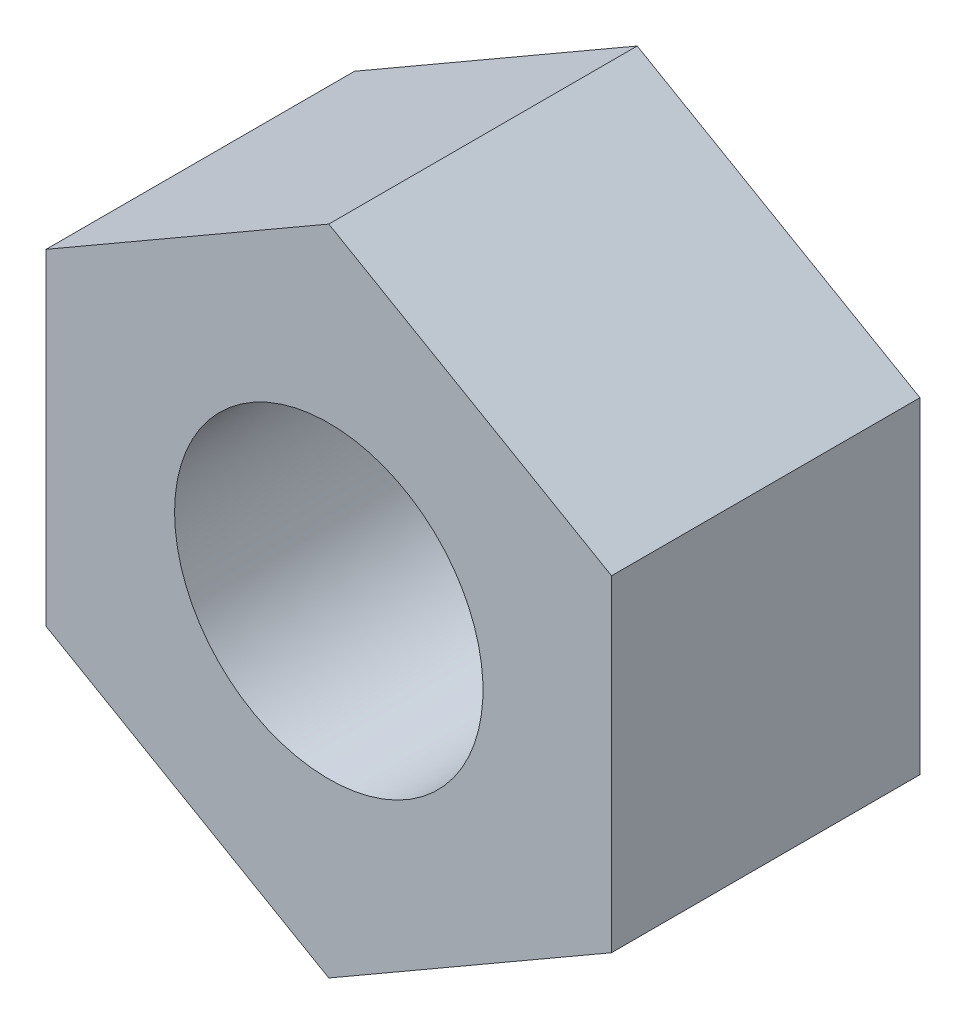
ISO-10303-21;
HEADER;
FILE_DESCRIPTION(('STEP AP214'),'2;1');
FILE_NAME('part.step','',(''),(''),'','','');
FILE_SCHEMA(('AUTOMOTIVE_DESIGN { 1 0 10303 214 1 1 1 1 }'));
ENDSEC;
DATA;
#1=APPLICATION_CONTEXT('core data for automotive mechanical design processes');
#2=APPLICATION_PROTOCOL_DEFINITION('international standard','automotive_design',2000,#1);
#3=PRODUCT_CONTEXT('',#1,'mechanical');
#4=PRODUCT('Part','Part','',(#3));
#5=PRODUCT_RELATED_PRODUCT_CATEGORY('part','',(#4));
#6=PRODUCT_DEFINITION_FORMATION('','',#4);
#7=PRODUCT_DEFINITION_CONTEXT('part definition',#1,'design');
#8=PRODUCT_DEFINITION('design','',#6,#7);
#9=PRODUCT_DEFINITION_SHAPE('','',#8);
#10=(LENGTH_UNIT() NAMED_UNIT(*) SI_UNIT(.MILLI.,.METRE.));
#11=(NAMED_UNIT(*) PLANE_ANGLE_UNIT() SI_UNIT($,.RADIAN.));
#12=(NAMED_UNIT(*) SI_UNIT($,.STERADIAN.) SOLID_ANGLE_UNIT());
#13=UNCERTAINTY_MEASURE_WITH_UNIT(LENGTH_MEASURE(1.E-05),#10,'distance_accuracy_value','');
#14=(GEOMETRIC_REPRESENTATION_CONTEXT(3) GLOBAL_UNCERTAINTY_ASSIGNED_CONTEXT((#13)) GLOBAL_UNIT_ASSIGNED_CONTEXT((#10,
#11,#12)) REPRESENTATION_CONTEXT('',''));
#15=CARTESIAN_POINT('',(0.,0.,0.));
#16=DIRECTION('',(0.,0.,1.));
#17=DIRECTION('',(1.,0.,0.));
#18=AXIS2_PLACEMENT_3D('',#15,#16,#17);
#19=CARTESIAN_POINT('',(2.75,1.58771324027147,1.5));
#20=DIRECTION('',(-0.5,-0.866025403784439,0.));
#21=DIRECTION('',(0.866025403784439,-0.5,0.));
#22=AXIS2_PLACEMENT_3D('',#19,#20,#21);
#23=PLANE('',#22);
#24=DIRECTION('',(-0.866025403784438,0.5,0.));
#25=VECTOR('',#24,1.);
#26=CARTESIAN_POINT('',(2.75,1.58771324027147,-1.5));
#27=LINE('',#26,#25);
#28=CARTESIAN_POINT('',(2.75,1.58771324027147,-1.5));
#29=VERTEX_POINT('',#28);
#30=CARTESIAN_POINT('',(0.,3.17542648054294,-1.5));
#31=VERTEX_POINT('',#30);
#32=EDGE_CURVE('E130',#29,#31,#27,.T.);
#33=ORIENTED_EDGE('',*,*,#32,.T.);
#34=DIRECTION('',(0.,0.,-1.));
#35=VECTOR('',#34,1.);
#36=CARTESIAN_POINT('',(0.,3.17542648054294,1.5));
#37=LINE('',#36,#35);
#38=CARTESIAN_POINT('',(0.,3.17542648054294,1.5));
#39=VERTEX_POINT('',#38);
#40=EDGE_CURVE('E11',#39,#31,#37,.T.);
#41=ORIENTED_EDGE('',*,*,#40,.F.);
#42=DIRECTION('',(-0.866025403784438,0.5,0.));
#43=VECTOR('',#42,1.);
#44=CARTESIAN_POINT('',(2.75,1.58771324027147,1.5));
#45=LINE('',#44,#43);
#46=CARTESIAN_POINT('',(2.75,1.58771324027147,1.5));
#47=VERTEX_POINT('',#46);
#48=EDGE_CURVE('E140',#47,#39,#45,.T.);
#49=ORIENTED_EDGE('',*,*,#48,.F.);
#50=DIRECTION('',(0.,0.,-1.));
#51=VECTOR('',#50,1.);
#52=CARTESIAN_POINT('',(2.75,1.58771324027147,1.5));
#53=LINE('',#52,#51);
#54=EDGE_CURVE('E123',#47,#29,#53,.T.);
#55=ORIENTED_EDGE('',*,*,#54,.T.);
#56=EDGE_LOOP('',(#33,#41,#49,#55));
#57=FACE_BOUND('',#56,.T.);
#58=ADVANCED_FACE('F43',(#57),#23,.F.);
#59=CARTESIAN_POINT('',(0.,3.17542648054294,1.5));
#60=DIRECTION('',(0.5,-0.866025403784439,0.));
#61=DIRECTION('',(0.866025403784439,0.5,0.));
#62=AXIS2_PLACEMENT_3D('',#59,#60,#61);
#63=PLANE('',#62);
#64=DIRECTION('',(-0.866025403784439,-0.5,0.));
#65=VECTOR('',#64,1.);
#66=CARTESIAN_POINT('',(0.,3.17542648054294,-1.5));
#67=LINE('',#66,#65);
#68=CARTESIAN_POINT('',(-2.75,1.58771324027147,-1.5));
#69=VERTEX_POINT('',#68);
#70=EDGE_CURVE('E129',#31,#69,#67,.T.);
#71=ORIENTED_EDGE('',*,*,#70,.T.);
#72=DIRECTION('',(0.,0.,-1.));
#73=VECTOR('',#72,1.);
#74=CARTESIAN_POINT('',(-2.75,1.58771324027147,1.5));
#75=LINE('',#74,#73);
#76=CARTESIAN_POINT('',(-2.75,1.58771324027147,1.5));
#77=VERTEX_POINT('',#76);
#78=EDGE_CURVE('E51',#77,#69,#75,.T.);
#79=ORIENTED_EDGE('',*,*,#78,.F.);
#80=DIRECTION('',(-0.866025403784439,-0.5,0.));
#81=VECTOR('',#80,1.);
#82=CARTESIAN_POINT('',(0.,3.17542648054294,1.5));
#83=LINE('',#82,#81);
#84=EDGE_CURVE('E97',#39,#77,#83,.T.);
#85=ORIENTED_EDGE('',*,*,#84,.F.);
#86=ORIENTED_EDGE('',*,*,#40,.T.);
#87=EDGE_LOOP('',(#71,#79,#85,#86));
#88=FACE_BOUND('',#87,.T.);
#89=ADVANCED_FACE('F163',(#88),#63,.F.);
#90=CARTESIAN_POINT('',(-2.75,1.58771324027147,1.5));
#91=DIRECTION('',(1.,0.,0.));
#92=DIRECTION('',(0.,0.,-1.));
#93=AXIS2_PLACEMENT_3D('',#90,#91,#92);
#94=PLANE('',#93);
#95=DIRECTION('',(0.,-1.,0.));
#96=VECTOR('',#95,1.);
#97=CARTESIAN_POINT('',(-2.75,1.58771324027147,-1.5));
#98=LINE('',#97,#96);
#99=CARTESIAN_POINT('',(-2.75,-1.58771324027147,-1.5));
#100=VERTEX_POINT('',#99);
#101=EDGE_CURVE('E134',#69,#100,#98,.T.);
#102=ORIENTED_EDGE('',*,*,#101,.T.);
#103=DIRECTION('',(0.,0.,-1.));
#104=VECTOR('',#103,1.);
#105=CARTESIAN_POINT('',(-2.75,-1.58771324027147,1.5));
#106=LINE('',#105,#104);
#107=CARTESIAN_POINT('',(-2.75,-1.58771324027147,1.5));
#108=VERTEX_POINT('',#107);
#109=EDGE_CURVE('E118',#108,#100,#106,.T.);
#110=ORIENTED_EDGE('',*,*,#109,.F.);
#111=DIRECTION('',(0.,-1.,0.));
#112=VECTOR('',#111,1.);
#113=CARTESIAN_POINT('',(-2.75,1.58771324027147,1.5));
#114=LINE('',#113,#112);
#115=EDGE_CURVE('E110',#77,#108,#114,.T.);
#116=ORIENTED_EDGE('',*,*,#115,.F.);
#117=ORIENTED_EDGE('',*,*,#78,.T.);
#118=EDGE_LOOP('',(#102,#110,#116,#117));
#119=FACE_BOUND('',#118,.T.);
#120=ADVANCED_FACE('F143',(#119),#94,.F.);
#121=CARTESIAN_POINT('',(-2.75,-1.58771324027147,1.5));
#122=DIRECTION('',(0.5,0.866025403784438,0.));
#123=DIRECTION('',(-0.866025403784438,0.5,0.));
#124=AXIS2_PLACEMENT_3D('',#121,#122,#123);
#125=PLANE('',#124);
#126=DIRECTION('',(0.866025403784438,-0.5,0.));
#127=VECTOR('',#126,1.);
#128=CARTESIAN_POINT('',(-2.75,-1.58771324027147,-1.5));
#129=LINE('',#128,#127);
#130=CARTESIAN_POINT('',(0.,-3.17542648054294,-1.5));
#131=VERTEX_POINT('',#130);
#132=EDGE_CURVE('E120',#100,#131,#129,.T.);
#133=ORIENTED_EDGE('',*,*,#132,.T.);
#134=DIRECTION('',(0.,0.,-1.));
#135=VECTOR('',#134,1.);
#136=CARTESIAN_POINT('',(0.,-3.17542648054294,1.5));
#137=LINE('',#136,#135);
#138=CARTESIAN_POINT('',(0.,-3.17542648054294,1.5));
#139=VERTEX_POINT('',#138);
#140=EDGE_CURVE('E114',#139,#131,#137,.T.);
#141=ORIENTED_EDGE('',*,*,#140,.F.);
#142=DIRECTION('',(0.866025403784438,-0.5,0.));
#143=VECTOR('',#142,1.);
#144=CARTESIAN_POINT('',(-2.75,-1.58771324027147,1.5));
#145=LINE('',#144,#143);
#146=EDGE_CURVE('E103',#108,#139,#145,.T.);
#147=ORIENTED_EDGE('',*,*,#146,.F.);
#148=ORIENTED_EDGE('',*,*,#109,.T.);
#149=EDGE_LOOP('',(#133,#141,#147,#148));
#150=FACE_BOUND('',#149,.T.);
#151=ADVANCED_FACE('F112',(#150),#125,.F.);
#152=CARTESIAN_POINT('',(0.,-3.17542648054294,1.5));
#153=DIRECTION('',(-0.5,0.866025403784439,0.));
#154=DIRECTION('',(-0.866025403784439,-0.5,0.));
#155=AXIS2_PLACEMENT_3D('',#152,#153,#154);
#156=PLANE('',#155);
#157=DIRECTION('',(0.866025403784439,0.5,0.));
#158=VECTOR('',#157,1.);
#159=CARTESIAN_POINT('',(0.,-3.17542648054294,-1.5));
#160=LINE('',#159,#158);
#161=CARTESIAN_POINT('',(2.75,-1.58771324027147,-1.5));
#162=VERTEX_POINT('',#161);
#163=EDGE_CURVE('E85',#131,#162,#160,.T.);
#164=ORIENTED_EDGE('',*,*,#163,.T.);
#165=DIRECTION('',(0.,0.,-1.));
#166=VECTOR('',#165,1.);
#167=CARTESIAN_POINT('',(2.75,-1.58771324027147,1.5));
#168=LINE('',#167,#166);
#169=CARTESIAN_POINT('',(2.75,-1.58771324027147,1.5));
#170=VERTEX_POINT('',#169);
#171=EDGE_CURVE('E117',#170,#162,#168,.T.);
#172=ORIENTED_EDGE('',*,*,#171,.F.);
#173=DIRECTION('',(0.866025403784439,0.5,0.));
#174=VECTOR('',#173,1.);
#175=CARTESIAN_POINT('',(0.,-3.17542648054294,1.5));
#176=LINE('',#175,#174);
#177=EDGE_CURVE('E107',#139,#170,#176,.T.);
#178=ORIENTED_EDGE('',*,*,#177,.F.);
#179=ORIENTED_EDGE('',*,*,#140,.T.);
#180=EDGE_LOOP('',(#164,#172,#178,#179));
#181=FACE_BOUND('',#180,.T.);
#182=ADVANCED_FACE('F121',(#181),#156,.F.);
#183=CARTESIAN_POINT('',(2.75,-1.58771324027147,1.5));
#184=DIRECTION('',(-1.,0.,0.));
#185=DIRECTION('',(0.,0.,1.));
#186=AXIS2_PLACEMENT_3D('',#183,#184,#185);
#187=PLANE('',#186);
#188=DIRECTION('',(0.,1.,0.));
#189=VECTOR('',#188,1.);
#190=CARTESIAN_POINT('',(2.75,-1.58771324027147,-1.5));
#191=LINE('',#190,#189);
#192=EDGE_CURVE('E90',#162,#29,#191,.T.);
#193=ORIENTED_EDGE('',*,*,#192,.T.);
#194=ORIENTED_EDGE('',*,*,#54,.F.);
#195=DIRECTION('',(0.,1.,0.));
#196=VECTOR('',#195,1.);
#197=CARTESIAN_POINT('',(2.75,-1.58771324027147,1.5));
#198=LINE('',#197,#196);
#199=EDGE_CURVE('E56',#170,#47,#198,.T.);
#200=ORIENTED_EDGE('',*,*,#199,.F.);
#201=ORIENTED_EDGE('',*,*,#171,.T.);
#202=EDGE_LOOP('',(#193,#194,#200,#201));
#203=FACE_BOUND('',#202,.T.);
#204=ADVANCED_FACE('F152',(#203),#187,.F.);
#205=CARTESIAN_POINT('',(0.,0.,1.5));
#206=DIRECTION('',(0.,0.,1.));
#207=DIRECTION('',(1.,0.,0.));
#208=AXIS2_PLACEMENT_3D('',#205,#206,#207);
#209=PLANE('',#208);
#210=CARTESIAN_POINT('',(0.,0.,1.5));
#211=DIRECTION('',(0.,0.,1.));
#212=DIRECTION('',(1.,0.,0.));
#213=AXIS2_PLACEMENT_3D('',#210,#211,#212);
#214=CIRCLE('',#213,1.5);
#215=CARTESIAN_POINT('',(-1.5,0.,1.5));
#216=VERTEX_POINT('',#215);
#217=EDGE_CURVE('E132',#216,#216,#214,.F.);
#218=ORIENTED_EDGE('',*,*,#217,.T.);
#219=EDGE_LOOP('',(#218));
#220=FACE_BOUND('',#219,.T.);
#221=ORIENTED_EDGE('',*,*,#48,.T.);
#222=ORIENTED_EDGE('',*,*,#84,.T.);
#223=ORIENTED_EDGE('',*,*,#115,.T.);
#224=ORIENTED_EDGE('',*,*,#146,.T.);
#225=ORIENTED_EDGE('',*,*,#177,.T.);
#226=ORIENTED_EDGE('',*,*,#199,.T.);
#227=EDGE_LOOP('',(#221,#222,#223,#224,#225,#226));
#228=FACE_BOUND('',#227,.T.);
#229=ADVANCED_FACE('F101',(#220,#228),#209,.T.);
#230=CARTESIAN_POINT('',(0.,0.,-1.5));
#231=DIRECTION('',(0.,0.,1.));
#232=DIRECTION('',(1.,0.,0.));
#233=AXIS2_PLACEMENT_3D('',#230,#231,#232);
#234=PLANE('',#233);
#235=CARTESIAN_POINT('',(0.,0.,-1.5));
#236=DIRECTION('',(0.,0.,-1.));
#237=DIRECTION('',(-1.,0.,0.));
#238=AXIS2_PLACEMENT_3D('',#235,#236,#237);
#239=CIRCLE('',#238,1.5);
#240=CARTESIAN_POINT('',(-1.5,0.,-1.5));
#241=VERTEX_POINT('',#240);
#242=EDGE_CURVE('E236',#241,#241,#239,.T.);
#243=ORIENTED_EDGE('',*,*,#242,.F.);
#244=EDGE_LOOP('',(#243));
#245=FACE_BOUND('',#244,.T.);
#246=ORIENTED_EDGE('',*,*,#32,.F.);
#247=ORIENTED_EDGE('',*,*,#192,.F.);
#248=ORIENTED_EDGE('',*,*,#163,.F.);
#249=ORIENTED_EDGE('',*,*,#132,.F.);
#250=ORIENTED_EDGE('',*,*,#101,.F.);
#251=ORIENTED_EDGE('',*,*,#70,.F.);
#252=EDGE_LOOP('',(#246,#247,#248,#249,#250,#251));
#253=FACE_BOUND('',#252,.T.);
#254=ADVANCED_FACE('F150',(#245,#253),#234,.F.);
#255=CARTESIAN_POINT('',(0.,0.,5.74264068711929));
#256=DIRECTION('',(0.,0.,-1.));
#257=DIRECTION('',(-1.,0.,0.));
#258=AXIS2_PLACEMENT_3D('',#255,#256,#257);
#259=CYLINDRICAL_SURFACE('',#258,1.5);
#260=CARTESIAN_POINT('',(-1.5,0.,-1.5));
#261=CARTESIAN_POINT('',(-1.5,0.,-1.46875));
#262=CARTESIAN_POINT('',(-1.5,0.,-1.4375));
#263=CARTESIAN_POINT('',(-1.5,0.,-1.375));
#264=CARTESIAN_POINT('',(-1.5,0.,-1.34375));
#265=CARTESIAN_POINT('',(-1.5,0.,-1.28125));
#266=CARTESIAN_POINT('',(-1.5,0.,-1.25));
#267=CARTESIAN_POINT('',(-1.5,0.,-1.1875));
#268=CARTESIAN_POINT('',(-1.5,0.,-1.15625));
#269=CARTESIAN_POINT('',(-1.5,0.,-1.09375));
#270=CARTESIAN_POINT('',(-1.5,0.,-1.0625));
#271=CARTESIAN_POINT('',(-1.5,0.,-1.));
#272=CARTESIAN_POINT('',(-1.5,0.,-0.968750000000001));
#273=CARTESIAN_POINT('',(-1.5,0.,-0.906250000000001));
#274=CARTESIAN_POINT('',(-1.5,0.,-0.875000000000001));
#275=CARTESIAN_POINT('',(-1.5,0.,-0.812500000000001));
#276=CARTESIAN_POINT('',(-1.5,0.,-0.781250000000001));
#277=CARTESIAN_POINT('',(-1.5,0.,-0.718750000000001));
#278=CARTESIAN_POINT('',(-1.5,0.,-0.687500000000001));
#279=CARTESIAN_POINT('',(-1.5,0.,-0.625000000000001));
#280=CARTESIAN_POINT('',(-1.5,0.,-0.593750000000001));
#281=CARTESIAN_POINT('',(-1.5,0.,-0.531250000000001));
#282=CARTESIAN_POINT('',(-1.5,0.,-0.500000000000001));
#283=CARTESIAN_POINT('',(-1.5,0.,-0.437500000000001));
#284=CARTESIAN_POINT('',(-1.5,0.,-0.406250000000001));
#285=CARTESIAN_POINT('',(-1.5,0.,-0.343750000000001));
#286=CARTESIAN_POINT('',(-1.5,0.,-0.312500000000001));
#287=CARTESIAN_POINT('',(-1.5,0.,-0.250000000000001));
#288=CARTESIAN_POINT('',(-1.5,0.,-0.218750000000001));
#289=CARTESIAN_POINT('',(-1.5,0.,-0.156250000000001));
#290=CARTESIAN_POINT('',(-1.5,0.,-0.125000000000001));
#291=CARTESIAN_POINT('',(-1.5,0.,-0.0625000000000009));
#292=CARTESIAN_POINT('',(-1.5,0.,-0.0312500000000009));
#293=CARTESIAN_POINT('',(-1.5,0.,0.0312499999999992));
#294=CARTESIAN_POINT('',(-1.5,0.,0.0624999999999992));
#295=CARTESIAN_POINT('',(-1.5,0.,0.124999999999999));
#296=CARTESIAN_POINT('',(-1.5,0.,0.156249999999999));
#297=CARTESIAN_POINT('',(-1.5,0.,0.218749999999999));
#298=CARTESIAN_POINT('',(-1.5,0.,0.249999999999999));
#299=CARTESIAN_POINT('',(-1.5,0.,0.312499999999999));
#300=CARTESIAN_POINT('',(-1.5,0.,0.343749999999999));
#301=CARTESIAN_POINT('',(-1.5,0.,0.40625));
#302=CARTESIAN_POINT('',(-1.5,0.,0.4375));
#303=CARTESIAN_POINT('',(-1.5,0.,0.499999999999999));
#304=CARTESIAN_POINT('',(-1.5,0.,0.531249999999999));
#305=CARTESIAN_POINT('',(-1.5,0.,0.593749999999999));
#306=CARTESIAN_POINT('',(-1.5,0.,0.624999999999999));
#307=CARTESIAN_POINT('',(-1.5,0.,0.687499999999999));
#308=CARTESIAN_POINT('',(-1.5,0.,0.718749999999999));
#309=CARTESIAN_POINT('',(-1.5,0.,0.781249999999999));
#310=CARTESIAN_POINT('',(-1.5,0.,0.812499999999999));
#311=CARTESIAN_POINT('',(-1.5,0.,0.874999999999999));
#312=CARTESIAN_POINT('',(-1.5,0.,0.906249999999999));
#313=CARTESIAN_POINT('',(-1.5,0.,0.968749999999999));
#314=CARTESIAN_POINT('',(-1.5,0.,0.999999999999999));
#315=CARTESIAN_POINT('',(-1.5,0.,1.0625));
#316=CARTESIAN_POINT('',(-1.5,0.,1.09375));
#317=CARTESIAN_POINT('',(-1.5,0.,1.15625));
#318=CARTESIAN_POINT('',(-1.5,0.,1.1875));
#319=CARTESIAN_POINT('',(-1.5,0.,1.25));
#320=CARTESIAN_POINT('',(-1.5,0.,1.28125));
#321=CARTESIAN_POINT('',(-1.5,0.,1.34375));
#322=CARTESIAN_POINT('',(-1.5,0.,1.375));
#323=CARTESIAN_POINT('',(-1.5,0.,1.4375));
#324=CARTESIAN_POINT('',(-1.5,0.,1.46875));
#325=CARTESIAN_POINT('',(-1.5,0.,1.5));
#326=B_SPLINE_CURVE_WITH_KNOTS('',3,(#260,#261,#262,#263,#264,#265,#266,#267,#268,#269,#270,
#271,#272,#273,#274,#275,#276,#277,#278,#279,#280,#281,#282,#283,#284,#285,#286,#287,#288,#289,
#290,#291,#292,#293,#294,#295,#296,#297,#298,#299,#300,#301,#302,#303,#304,#305,#306,#307,#308,
#309,#310,#311,#312,#313,#314,#315,#316,#317,#318,#319,#320,#321,#322,#323,#324,#325),
.UNSPECIFIED.,.F.,.F.,(4,2,2,2,2,2,2,2,2,2,2,2,2,2,2,2,2,2,2,2,2,2,2,2,2,2,2,2,2,2,2,2,4),(0.,
0.0937500000000001,0.1875,0.28125,0.375,0.46875,0.5625,0.65625,0.75,0.84375,0.9375,1.03125,
1.125,1.21875,1.3125,1.40625,1.5,1.59375,1.6875,1.78125,1.875,1.96875,2.0625,2.15625,2.25,
2.34375,2.4375,2.53125,2.625,2.71875,2.8125,2.90625,3.),.UNSPECIFIED.);
#327=EDGE_CURVE('BSEAM186',#241,#216,#326,.T.);
#328=ORIENTED_EDGE('',*,*,#242,.T.);
#329=ORIENTED_EDGE('',*,*,#217,.F.);
#330=ORIENTED_EDGE('',*,*,#327,.T.);
#331=ORIENTED_EDGE('',*,*,#327,.F.);
#332=EDGE_LOOP('',(#328,#330,#329,#331));
#333=FACE_BOUND('',#332,.T.);
#334=ADVANCED_FACE('F186',(#333),#259,.F.);
#335=CLOSED_SHELL('',(#58,#89,#120,#151,#182,#204,#229,#254,#334));
#336=MANIFOLD_SOLID_BREP('B2',#335);
#337=ADVANCED_BREP_SHAPE_REPRESENTATION('',(#18,#336),#14);
#338=SHAPE_DEFINITION_REPRESENTATION(#9,#337);
ENDSEC;
END-ISO-10303-21;
